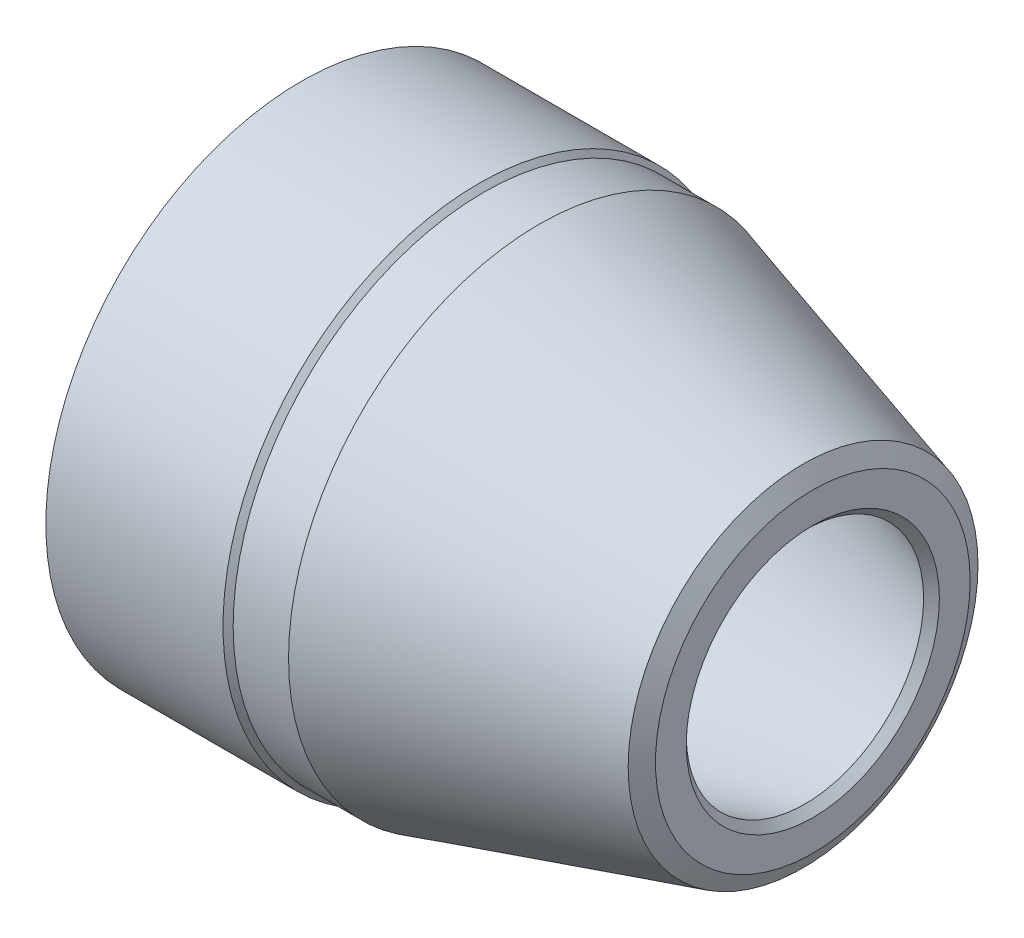
ISO-10303-21;
HEADER;
FILE_DESCRIPTION(('STEP AP214'),'2;1');
FILE_NAME('part.step','',(''),(''),'','','');
FILE_SCHEMA(('AUTOMOTIVE_DESIGN { 1 0 10303 214 1 1 1 1 }'));
ENDSEC;
DATA;
#1=APPLICATION_CONTEXT('core data for automotive mechanical design processes');
#2=APPLICATION_PROTOCOL_DEFINITION('international standard','automotive_design',2000,#1);
#3=PRODUCT_CONTEXT('',#1,'mechanical');
#4=PRODUCT('Part','Part','',(#3));
#5=PRODUCT_RELATED_PRODUCT_CATEGORY('part','',(#4));
#6=PRODUCT_DEFINITION_FORMATION('','',#4);
#7=PRODUCT_DEFINITION_CONTEXT('part definition',#1,'design');
#8=PRODUCT_DEFINITION('design','',#6,#7);
#9=PRODUCT_DEFINITION_SHAPE('','',#8);
#10=(LENGTH_UNIT() NAMED_UNIT(*) SI_UNIT(.MILLI.,.METRE.));
#11=(NAMED_UNIT(*) PLANE_ANGLE_UNIT() SI_UNIT($,.RADIAN.));
#12=(NAMED_UNIT(*) SI_UNIT($,.STERADIAN.) SOLID_ANGLE_UNIT());
#13=UNCERTAINTY_MEASURE_WITH_UNIT(LENGTH_MEASURE(1.E-05),#10,'distance_accuracy_value','');
#14=(GEOMETRIC_REPRESENTATION_CONTEXT(3) GLOBAL_UNCERTAINTY_ASSIGNED_CONTEXT((#13)) GLOBAL_UNIT_ASSIGNED_CONTEXT((#10,
#11,#12)) REPRESENTATION_CONTEXT('',''));
#15=CARTESIAN_POINT('',(0.,0.,0.));
#16=DIRECTION('',(0.,0.,1.));
#17=DIRECTION('',(1.,0.,0.));
#18=AXIS2_PLACEMENT_3D('',#15,#16,#17);
#19=CARTESIAN_POINT('',(0.,0.,0.));
#20=DIRECTION('',(1.,0.,0.));
#21=DIRECTION('',(0.,0.,-1.));
#22=AXIS2_PLACEMENT_3D('',#19,#20,#21);
#23=CYLINDRICAL_SURFACE('',#22,25.25);
#24=CARTESIAN_POINT('',(0.,0.,0.));
#25=DIRECTION('',(1.,0.,0.));
#26=DIRECTION('',(0.,0.,-1.));
#27=AXIS2_PLACEMENT_3D('',#24,#25,#26);
#28=CIRCLE('',#27,25.25);
#29=CARTESIAN_POINT('',(0.,0.,-25.25));
#30=VERTEX_POINT('',#29);
#31=EDGE_CURVE('E84',#30,#30,#28,.T.);
#32=ORIENTED_EDGE('',*,*,#31,.T.);
#33=EDGE_LOOP('',(#32));
#34=FACE_BOUND('',#33,.T.);
#35=CARTESIAN_POINT('',(17.5,0.,0.));
#36=DIRECTION('',(1.,0.,0.));
#37=DIRECTION('',(0.,0.,-1.));
#38=AXIS2_PLACEMENT_3D('',#35,#36,#37);
#39=CIRCLE('',#38,25.25);
#40=CARTESIAN_POINT('',(17.5,0.,-25.25));
#41=VERTEX_POINT('',#40);
#42=EDGE_CURVE('E63',#41,#41,#39,.T.);
#43=ORIENTED_EDGE('',*,*,#42,.F.);
#44=EDGE_LOOP('',(#43));
#45=FACE_BOUND('',#44,.T.);
#46=ADVANCED_FACE('F38',(#34,#45),#23,.T.);
#47=CARTESIAN_POINT('',(18.,0.,0.));
#48=DIRECTION('',(-1.,0.,0.));
#49=DIRECTION('',(0.,0.,1.));
#50=AXIS2_PLACEMENT_3D('',#47,#48,#49);
#51=CONICAL_SURFACE('',#50,24.75,0.785398163397455);
#52=ORIENTED_EDGE('',*,*,#42,.T.);
#53=EDGE_LOOP('',(#52));
#54=FACE_BOUND('',#53,.T.);
#55=CARTESIAN_POINT('',(18.,0.,0.));
#56=DIRECTION('',(1.,0.,0.));
#57=DIRECTION('',(0.,0.,-1.));
#58=AXIS2_PLACEMENT_3D('',#55,#56,#57);
#59=CIRCLE('',#58,24.75);
#60=CARTESIAN_POINT('',(18.,0.,-24.75));
#61=VERTEX_POINT('',#60);
#62=EDGE_CURVE('E66',#61,#61,#59,.T.);
#63=ORIENTED_EDGE('',*,*,#62,.F.);
#64=EDGE_LOOP('',(#63));
#65=FACE_BOUND('',#64,.T.);
#66=ADVANCED_FACE('F105',(#54,#65),#51,.T.);
#67=CARTESIAN_POINT('',(0.,0.,0.));
#68=DIRECTION('',(1.,0.,0.));
#69=DIRECTION('',(0.,0.,-1.));
#70=AXIS2_PLACEMENT_3D('',#67,#68,#69);
#71=CYLINDRICAL_SURFACE('',#70,24.75);
#72=ORIENTED_EDGE('',*,*,#62,.T.);
#73=EDGE_LOOP('',(#72));
#74=FACE_BOUND('',#73,.T.);
#75=CARTESIAN_POINT('',(23.472538060233,0.,0.));
#76=DIRECTION('',(1.,0.,0.));
#77=DIRECTION('',(0.,0.,-1.));
#78=AXIS2_PLACEMENT_3D('',#75,#76,#77);
#79=CIRCLE('',#78,24.75);
#80=CARTESIAN_POINT('',(23.472538060233,0.,-24.75));
#81=VERTEX_POINT('',#80);
#82=EDGE_CURVE('E69',#81,#81,#79,.T.);
#83=ORIENTED_EDGE('',*,*,#82,.F.);
#84=EDGE_LOOP('',(#83));
#85=FACE_BOUND('',#84,.T.);
#86=ADVANCED_FACE('F109',(#74,#85),#71,.T.);
#87=CARTESIAN_POINT('',(50.5,0.,0.));
#88=DIRECTION('',(-1.,0.,0.));
#89=DIRECTION('',(0.,0.,1.));
#90=AXIS2_PLACEMENT_3D('',#87,#88,#89);
#91=CONICAL_SURFACE('',#90,17.,0.279252680319093);
#92=CARTESIAN_POINT('',(49.5387383040617,0.,0.));
#93=DIRECTION('',(1.,0.,0.));
#94=DIRECTION('',(0.,0.,-1.));
#95=AXIS2_PLACEMENT_3D('',#92,#93,#94);
#96=CIRCLE('',#95,17.275637355817);
#97=CARTESIAN_POINT('',(49.5387383040617,0.,-17.275637355817));
#98=VERTEX_POINT('',#97);
#99=EDGE_CURVE('E52',#98,#98,#96,.F.);
#100=ORIENTED_EDGE('',*,*,#99,.T.);
#101=EDGE_LOOP('',(#100));
#102=FACE_BOUND('',#101,.T.);
#103=ORIENTED_EDGE('',*,*,#82,.T.);
#104=EDGE_LOOP('',(#103));
#105=FACE_BOUND('',#104,.T.);
#106=ADVANCED_FACE('F114',(#102,#105),#91,.T.);
#107=CARTESIAN_POINT('',(50.5,17.,0.));
#108=DIRECTION('',(1.,0.,0.));
#109=DIRECTION('',(0.,0.,-1.));
#110=AXIS2_PLACEMENT_3D('',#107,#108,#109);
#111=PLANE('',#110);
#112=CARTESIAN_POINT('',(50.5,0.,0.));
#113=DIRECTION('',(1.,0.,0.));
#114=DIRECTION('',(0.,0.,-1.));
#115=AXIS2_PLACEMENT_3D('',#112,#113,#114);
#116=CIRCLE('',#115,15.5414753510311);
#117=CARTESIAN_POINT('',(50.5,0.,-15.5414753510311));
#118=VERTEX_POINT('',#117);
#119=EDGE_CURVE('E57',#118,#118,#116,.T.);
#120=ORIENTED_EDGE('',*,*,#119,.T.);
#121=EDGE_LOOP('',(#120));
#122=FACE_BOUND('',#121,.T.);
#123=CARTESIAN_POINT('',(50.5,0.,0.));
#124=DIRECTION('',(1.,0.,0.));
#125=DIRECTION('',(0.,0.,-1.));
#126=AXIS2_PLACEMENT_3D('',#123,#124,#125);
#127=CIRCLE('',#126,12.5);
#128=CARTESIAN_POINT('',(50.5,0.,-12.5));
#129=VERTEX_POINT('',#128);
#130=EDGE_CURVE('E60',#129,#129,#127,.F.);
#131=ORIENTED_EDGE('',*,*,#130,.T.);
#132=EDGE_LOOP('',(#131));
#133=FACE_BOUND('',#132,.T.);
#134=ADVANCED_FACE('F121',(#122,#133),#111,.T.);
#135=CARTESIAN_POINT('',(17.3695627835115,0.,0.));
#136=DIRECTION('',(-1.,0.,0.));
#137=DIRECTION('',(0.,0.,1.));
#138=AXIS2_PLACEMENT_3D('',#135,#136,#137);
#139=CONICAL_SURFACE('',#138,21.,0.279252680319093);
#140=CARTESIAN_POINT('',(49.7228454742736,0.,0.));
#141=DIRECTION('',(1.,0.,0.));
#142=DIRECTION('',(0.,0.,-1.));
#143=AXIS2_PLACEMENT_3D('',#140,#141,#142);
#144=CIRCLE('',#143,11.7228454742736);
#145=CARTESIAN_POINT('',(49.7228454742736,0.,-11.7228454742736));
#146=VERTEX_POINT('',#145);
#147=EDGE_CURVE('E48',#146,#146,#144,.T.);
#148=ORIENTED_EDGE('',*,*,#147,.T.);
#149=EDGE_LOOP('',(#148));
#150=FACE_BOUND('',#149,.T.);
#151=CARTESIAN_POINT('',(17.3695627835115,0.,0.));
#152=DIRECTION('',(1.,0.,0.));
#153=DIRECTION('',(0.,0.,-1.));
#154=AXIS2_PLACEMENT_3D('',#151,#152,#153);
#155=CIRCLE('',#154,21.);
#156=CARTESIAN_POINT('',(17.3695627835115,0.,-21.));
#157=VERTEX_POINT('',#156);
#158=EDGE_CURVE('E72',#157,#157,#155,.T.);
#159=ORIENTED_EDGE('',*,*,#158,.F.);
#160=EDGE_LOOP('',(#159));
#161=FACE_BOUND('',#160,.T.);
#162=ADVANCED_FACE('F125',(#150,#161),#139,.F.);
#163=CARTESIAN_POINT('',(15.8695627835115,0.,0.));
#164=DIRECTION('',(-1.,0.,0.));
#165=DIRECTION('',(0.,0.,1.));
#166=AXIS2_PLACEMENT_3D('',#163,#164,#165);
#167=CONICAL_SURFACE('',#166,22.5,0.785398163397448);
#168=ORIENTED_EDGE('',*,*,#158,.T.);
#169=EDGE_LOOP('',(#168));
#170=FACE_BOUND('',#169,.T.);
#171=CARTESIAN_POINT('',(15.8695627835115,0.,0.));
#172=DIRECTION('',(1.,0.,0.));
#173=DIRECTION('',(0.,0.,-1.));
#174=AXIS2_PLACEMENT_3D('',#171,#172,#173);
#175=CIRCLE('',#174,22.5);
#176=CARTESIAN_POINT('',(15.8695627835115,0.,-22.5));
#177=VERTEX_POINT('',#176);
#178=EDGE_CURVE('E75',#177,#177,#175,.T.);
#179=ORIENTED_EDGE('',*,*,#178,.F.);
#180=EDGE_LOOP('',(#179));
#181=FACE_BOUND('',#180,.T.);
#182=ADVANCED_FACE('F129',(#170,#181),#167,.F.);
#183=CARTESIAN_POINT('',(0.,0.,0.));
#184=DIRECTION('',(1.,0.,0.));
#185=DIRECTION('',(0.,0.,-1.));
#186=AXIS2_PLACEMENT_3D('',#183,#184,#185);
#187=CYLINDRICAL_SURFACE('',#186,22.5);
#188=ORIENTED_EDGE('',*,*,#178,.T.);
#189=EDGE_LOOP('',(#188));
#190=FACE_BOUND('',#189,.T.);
#191=CARTESIAN_POINT('',(7.,0.,0.));
#192=DIRECTION('',(1.,0.,0.));
#193=DIRECTION('',(0.,0.,-1.));
#194=AXIS2_PLACEMENT_3D('',#191,#192,#193);
#195=CIRCLE('',#194,22.5);
#196=CARTESIAN_POINT('',(7.,0.,-22.5));
#197=VERTEX_POINT('',#196);
#198=EDGE_CURVE('E78',#197,#197,#195,.T.);
#199=ORIENTED_EDGE('',*,*,#198,.F.);
#200=EDGE_LOOP('',(#199));
#201=FACE_BOUND('',#200,.T.);
#202=ADVANCED_FACE('F133',(#190,#201),#187,.F.);
#203=CARTESIAN_POINT('',(7.,22.5,0.));
#204=DIRECTION('',(1.,0.,0.));
#205=DIRECTION('',(0.,0.,-1.));
#206=AXIS2_PLACEMENT_3D('',#203,#204,#205);
#207=PLANE('',#206);
#208=ORIENTED_EDGE('',*,*,#198,.T.);
#209=EDGE_LOOP('',(#208));
#210=FACE_BOUND('',#209,.T.);
#211=CARTESIAN_POINT('',(7.,0.,0.));
#212=DIRECTION('',(1.,0.,0.));
#213=DIRECTION('',(0.,0.,-1.));
#214=AXIS2_PLACEMENT_3D('',#211,#212,#213);
#215=CIRCLE('',#214,21.5);
#216=CARTESIAN_POINT('',(7.,0.,-21.5));
#217=VERTEX_POINT('',#216);
#218=EDGE_CURVE('E81',#217,#217,#215,.T.);
#219=ORIENTED_EDGE('',*,*,#218,.F.);
#220=EDGE_LOOP('',(#219));
#221=FACE_BOUND('',#220,.T.);
#222=ADVANCED_FACE('F102',(#210,#221),#207,.T.);
#223=CARTESIAN_POINT('',(0.,0.,0.));
#224=DIRECTION('',(1.,0.,0.));
#225=DIRECTION('',(0.,0.,-1.));
#226=AXIS2_PLACEMENT_3D('',#223,#224,#225);
#227=CYLINDRICAL_SURFACE('',#226,21.5);
#228=CARTESIAN_POINT('',(0.999999999999997,0.,0.));
#229=DIRECTION('',(-1.,0.,0.));
#230=DIRECTION('',(0.,0.,1.));
#231=AXIS2_PLACEMENT_3D('',#228,#229,#230);
#232=CIRCLE('',#231,21.5);
#233=CARTESIAN_POINT('',(0.999999999999997,0.,21.5));
#234=VERTEX_POINT('',#233);
#235=EDGE_CURVE('E10',#234,#234,#232,.T.);
#236=ORIENTED_EDGE('',*,*,#235,.T.);
#237=EDGE_LOOP('',(#236));
#238=FACE_BOUND('',#237,.T.);
#239=ORIENTED_EDGE('',*,*,#218,.T.);
#240=EDGE_LOOP('',(#239));
#241=FACE_BOUND('',#240,.T.);
#242=ADVANCED_FACE('F93',(#238,#241),#227,.F.);
#243=CARTESIAN_POINT('',(0.,21.5,0.));
#244=DIRECTION('',(-1.,0.,0.));
#245=DIRECTION('',(0.,0.,1.));
#246=AXIS2_PLACEMENT_3D('',#243,#244,#245);
#247=PLANE('',#246);
#248=CARTESIAN_POINT('',(0.,0.,0.));
#249=DIRECTION('',(-1.,0.,0.));
#250=DIRECTION('',(0.,0.,1.));
#251=AXIS2_PLACEMENT_3D('',#248,#249,#250);
#252=CIRCLE('',#251,22.5);
#253=CARTESIAN_POINT('',(0.,0.,22.5));
#254=VERTEX_POINT('',#253);
#255=EDGE_CURVE('E44',#254,#254,#252,.F.);
#256=ORIENTED_EDGE('',*,*,#255,.T.);
#257=EDGE_LOOP('',(#256));
#258=FACE_BOUND('',#257,.T.);
#259=ORIENTED_EDGE('',*,*,#31,.F.);
#260=EDGE_LOOP('',(#259));
#261=FACE_BOUND('',#260,.T.);
#262=ADVANCED_FACE('F90',(#258,#261),#247,.T.);
#263=CARTESIAN_POINT('',(50.5,0.,0.));
#264=DIRECTION('',(-1.,0.,0.));
#265=DIRECTION('',(0.,0.,1.));
#266=AXIS2_PLACEMENT_3D('',#263,#264,#265);
#267=CONICAL_SURFACE('',#266,15.5414753510311,1.06465084371654);
#268=ORIENTED_EDGE('',*,*,#99,.F.);
#269=EDGE_LOOP('',(#268));
#270=FACE_BOUND('',#269,.T.);
#271=ORIENTED_EDGE('',*,*,#119,.F.);
#272=EDGE_LOOP('',(#271));
#273=FACE_BOUND('',#272,.T.);
#274=ADVANCED_FACE('F92',(#270,#273),#267,.T.);
#275=CARTESIAN_POINT('',(49.7228454742736,0.,0.));
#276=DIRECTION('',(1.,0.,0.));
#277=DIRECTION('',(0.,0.,-1.));
#278=AXIS2_PLACEMENT_3D('',#275,#276,#277);
#279=CONICAL_SURFACE('',#278,11.7228454742736,0.78539816339745);
#280=CARTESIAN_POINT('',(50.5,0.,-12.5));
#281=CARTESIAN_POINT('',(50.491904640357,0.,-12.491904640357));
#282=CARTESIAN_POINT('',(50.483809280714,0.,-12.483809280714));
#283=CARTESIAN_POINT('',(50.4676185614281,0.,-12.4676185614281));
#284=CARTESIAN_POINT('',(50.4595232017851,0.,-12.4595232017851));
#285=CARTESIAN_POINT('',(50.4433324824991,0.,-12.4433324824991));
#286=CARTESIAN_POINT('',(50.4352371228561,0.,-12.4352371228561));
#287=CARTESIAN_POINT('',(50.4190464035702,0.,-12.4190464035702));
#288=CARTESIAN_POINT('',(50.4109510439272,0.,-12.4109510439272));
#289=CARTESIAN_POINT('',(50.3947603246412,0.,-12.3947603246412));
#290=CARTESIAN_POINT('',(50.3866649649982,0.,-12.3866649649982));
#291=CARTESIAN_POINT('',(50.3704742457123,0.,-12.3704742457123));
#292=CARTESIAN_POINT('',(50.3623788860693,0.,-12.3623788860693));
#293=CARTESIAN_POINT('',(50.3461881667833,0.,-12.3461881667833));
#294=CARTESIAN_POINT('',(50.3380928071403,0.,-12.3380928071403));
#295=CARTESIAN_POINT('',(50.3219020878544,0.,-12.3219020878544));
#296=CARTESIAN_POINT('',(50.3138067282114,0.,-12.3138067282114));
#297=CARTESIAN_POINT('',(50.2976160089254,0.,-12.2976160089254));
#298=CARTESIAN_POINT('',(50.2895206492824,0.,-12.2895206492824));
#299=CARTESIAN_POINT('',(50.2733299299965,0.,-12.2733299299965));
#300=CARTESIAN_POINT('',(50.2652345703535,0.,-12.2652345703535));
#301=CARTESIAN_POINT('',(50.2490438510675,0.,-12.2490438510675));
#302=CARTESIAN_POINT('',(50.2409484914245,0.,-12.2409484914245));
#303=CARTESIAN_POINT('',(50.2247577721386,0.,-12.2247577721386));
#304=CARTESIAN_POINT('',(50.2166624124956,0.,-12.2166624124956));
#305=CARTESIAN_POINT('',(50.2004716932096,0.,-12.2004716932096));
#306=CARTESIAN_POINT('',(50.1923763335666,0.,-12.1923763335666));
#307=CARTESIAN_POINT('',(50.1761856142807,0.,-12.1761856142807));
#308=CARTESIAN_POINT('',(50.1680902546377,0.,-12.1680902546377));
#309=CARTESIAN_POINT('',(50.1518995353517,0.,-12.1518995353517));
#310=CARTESIAN_POINT('',(50.1438041757087,0.,-12.1438041757087));
#311=CARTESIAN_POINT('',(50.1276134564228,0.,-12.1276134564228));
#312=CARTESIAN_POINT('',(50.1195180967798,0.,-12.1195180967798));
#313=CARTESIAN_POINT('',(50.1033273774938,0.,-12.1033273774938));
#314=CARTESIAN_POINT('',(50.0952320178508,0.,-12.0952320178508));
#315=CARTESIAN_POINT('',(50.0790412985649,0.,-12.0790412985649));
#316=CARTESIAN_POINT('',(50.0709459389219,0.,-12.0709459389219));
#317=CARTESIAN_POINT('',(50.0547552196359,0.,-12.0547552196359));
#318=CARTESIAN_POINT('',(50.0466598599929,0.,-12.0466598599929));
#319=CARTESIAN_POINT('',(50.030469140707,0.,-12.030469140707));
#320=CARTESIAN_POINT('',(50.022373781064,0.,-12.022373781064));
#321=CARTESIAN_POINT('',(50.006183061778,0.,-12.006183061778));
#322=CARTESIAN_POINT('',(49.998087702135,0.,-11.998087702135));
#323=CARTESIAN_POINT('',(49.9818969828491,0.,-11.9818969828491));
#324=CARTESIAN_POINT('',(49.9738016232061,0.,-11.9738016232061));
#325=CARTESIAN_POINT('',(49.9576109039201,0.,-11.9576109039201));
#326=CARTESIAN_POINT('',(49.9495155442771,0.,-11.9495155442771));
#327=CARTESIAN_POINT('',(49.9333248249912,0.,-11.9333248249912));
#328=CARTESIAN_POINT('',(49.9252294653482,0.,-11.9252294653482));
#329=CARTESIAN_POINT('',(49.9090387460622,0.,-11.9090387460622));
#330=CARTESIAN_POINT('',(49.9009433864193,0.,-11.9009433864192));
#331=CARTESIAN_POINT('',(49.8847526671333,0.,-11.8847526671333));
#332=CARTESIAN_POINT('',(49.8766573074903,0.,-11.8766573074903));
#333=CARTESIAN_POINT('',(49.8604665882043,0.,-11.8604665882043));
#334=CARTESIAN_POINT('',(49.8523712285614,0.,-11.8523712285614));
#335=CARTESIAN_POINT('',(49.8361805092754,0.,-11.8361805092754));
#336=CARTESIAN_POINT('',(49.8280851496324,0.,-11.8280851496324));
#337=CARTESIAN_POINT('',(49.8118944303464,0.,-11.8118944303464));
#338=CARTESIAN_POINT('',(49.8037990707034,0.,-11.8037990707035));
#339=CARTESIAN_POINT('',(49.7876083514175,0.,-11.7876083514175));
#340=CARTESIAN_POINT('',(49.7795129917745,0.,-11.7795129917745));
#341=CARTESIAN_POINT('',(49.7633222724885,0.,-11.7633222724885));
#342=CARTESIAN_POINT('',(49.7552269128456,0.,-11.7552269128456));
#343=CARTESIAN_POINT('',(49.7390361935596,0.,-11.7390361935596));
#344=CARTESIAN_POINT('',(49.7309408339166,0.,-11.7309408339166));
#345=CARTESIAN_POINT('',(49.7228454742736,0.,-11.7228454742736));
#346=B_SPLINE_CURVE_WITH_KNOTS('',3,(#280,#281,#282,#283,#284,#285,#286,#287,#288,#289,#290,
#291,#292,#293,#294,#295,#296,#297,#298,#299,#300,#301,#302,#303,#304,#305,#306,#307,#308,#309,
#310,#311,#312,#313,#314,#315,#316,#317,#318,#319,#320,#321,#322,#323,#324,#325,#326,#327,#328,
#329,#330,#331,#332,#333,#334,#335,#336,#337,#338,#339,#340,#341,#342,#343,#344,#345),
.UNSPECIFIED.,.F.,.F.,(4,2,2,2,2,2,2,2,2,2,2,2,2,2,2,2,2,2,2,2,2,2,2,2,2,2,2,2,2,2,2,2,4),(0.,
0.0343457021981813,0.0686914043963662,0.103037106594547,0.137382808792732,0.171728510990919,
0.206074213189099,0.240419915387285,0.27476561758547,0.309111319783651,0.343457021981837,
0.377802724180017,0.412148426378203,0.446494128576388,0.48083983077457,0.515185532972754,
0.549531235170941,0.583876937369122,0.618222639567307,0.652568341765488,0.686914043963673,
0.721259746161859,0.755605448360039,0.789951150558226,0.824296852756412,0.858642554954592,
0.892988257152778,0.927333959350958,0.961679661549144,0.996025363747329,1.03037106594551,
1.0647167681437,1.09906247034188),.UNSPECIFIED.);
#347=EDGE_CURVE('BSEAM99',#129,#146,#346,.T.);
#348=ORIENTED_EDGE('',*,*,#130,.F.);
#349=ORIENTED_EDGE('',*,*,#147,.F.);
#350=ORIENTED_EDGE('',*,*,#347,.T.);
#351=ORIENTED_EDGE('',*,*,#347,.F.);
#352=EDGE_LOOP('',(#348,#350,#349,#351));
#353=FACE_BOUND('',#352,.T.);
#354=ADVANCED_FACE('F99',(#353),#279,.F.);
#355=CARTESIAN_POINT('',(0.,0.,0.));
#356=DIRECTION('',(-1.,0.,0.));
#357=DIRECTION('',(0.,0.,1.));
#358=AXIS2_PLACEMENT_3D('',#355,#356,#357);
#359=CONICAL_SURFACE('',#358,22.5,0.785398163397447);
#360=ORIENTED_EDGE('',*,*,#235,.F.);
#361=EDGE_LOOP('',(#360));
#362=FACE_BOUND('',#361,.T.);
#363=ORIENTED_EDGE('',*,*,#255,.F.);
#364=EDGE_LOOP('',(#363));
#365=FACE_BOUND('',#364,.T.);
#366=ADVANCED_FACE('F223',(#362,#365),#359,.F.);
#367=CLOSED_SHELL('',(#46,#66,#86,#106,#134,#162,#182,#202,#222,#242,#262,#274,#354,#366));
#368=MANIFOLD_SOLID_BREP('B2',#367);
#369=ADVANCED_BREP_SHAPE_REPRESENTATION('',(#18,#368),#14);
#370=SHAPE_DEFINITION_REPRESENTATION(#9,#369);
ENDSEC;
END-ISO-10303-21;
